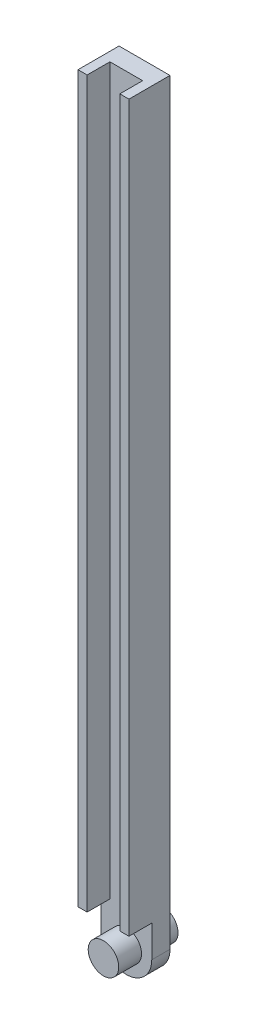
ISO-10303-21;
HEADER;
FILE_DESCRIPTION(('STEP AP214'),'2;1');
FILE_NAME('part.step','',(''),(''),'','','');
FILE_SCHEMA(('AUTOMOTIVE_DESIGN { 1 0 10303 214 1 1 1 1 }'));
ENDSEC;
DATA;
#1=APPLICATION_CONTEXT('core data for automotive mechanical design processes');
#2=APPLICATION_PROTOCOL_DEFINITION('international standard','automotive_design',2000,#1);
#3=PRODUCT_CONTEXT('',#1,'mechanical');
#4=PRODUCT('Part','Part','',(#3));
#5=PRODUCT_RELATED_PRODUCT_CATEGORY('part','',(#4));
#6=PRODUCT_DEFINITION_FORMATION('','',#4);
#7=PRODUCT_DEFINITION_CONTEXT('part definition',#1,'design');
#8=PRODUCT_DEFINITION('design','',#6,#7);
#9=PRODUCT_DEFINITION_SHAPE('','',#8);
#10=(LENGTH_UNIT() NAMED_UNIT(*) SI_UNIT(.MILLI.,.METRE.));
#11=(NAMED_UNIT(*) PLANE_ANGLE_UNIT() SI_UNIT($,.RADIAN.));
#12=(NAMED_UNIT(*) SI_UNIT($,.STERADIAN.) SOLID_ANGLE_UNIT());
#13=UNCERTAINTY_MEASURE_WITH_UNIT(LENGTH_MEASURE(1.E-05),#10,'distance_accuracy_value','');
#14=(GEOMETRIC_REPRESENTATION_CONTEXT(3) GLOBAL_UNCERTAINTY_ASSIGNED_CONTEXT((#13)) GLOBAL_UNIT_ASSIGNED_CONTEXT((#10,
#11,#12)) REPRESENTATION_CONTEXT('',''));
#15=CARTESIAN_POINT('',(0.,0.,0.));
#16=DIRECTION('',(0.,0.,1.));
#17=DIRECTION('',(1.,0.,0.));
#18=AXIS2_PLACEMENT_3D('',#15,#16,#17);
#19=CARTESIAN_POINT('',(-1300.10015144345,-1591.6006167327,50.8));
#20=DIRECTION('',(-1.,0.,0.));
#21=DIRECTION('',(0.,0.,1.));
#22=AXIS2_PLACEMENT_3D('',#19,#20,#21);
#23=PLANE('',#22);
#24=DIRECTION('',(0.,1.,0.));
#25=VECTOR('',#24,1.);
#26=CARTESIAN_POINT('',(-1300.10015144345,-1591.6006167327,0.));
#27=LINE('',#26,#25);
#28=CARTESIAN_POINT('',(-1300.10015144345,-911.736177466732,0.));
#29=VERTEX_POINT('',#28);
#30=CARTESIAN_POINT('',(-1300.10015144345,1195.64571589692,0.));
#31=VERTEX_POINT('',#30);
#32=EDGE_CURVE('E173',#29,#31,#27,.T.);
#33=ORIENTED_EDGE('',*,*,#32,.F.);
#34=DIRECTION('',(0.,0.,-1.));
#35=VECTOR('',#34,1.);
#36=CARTESIAN_POINT('',(-1300.10015144345,-911.736177466732,50.8));
#37=LINE('',#36,#35);
#38=CARTESIAN_POINT('',(-1300.10015144345,-911.736177466732,50.8));
#39=VERTEX_POINT('',#38);
#40=EDGE_CURVE('E11',#39,#29,#37,.T.);
#41=ORIENTED_EDGE('',*,*,#40,.F.);
#42=DIRECTION('',(0.,1.,0.));
#43=VECTOR('',#42,1.);
#44=CARTESIAN_POINT('',(-1300.10015144345,-1591.6006167327,50.8));
#45=LINE('',#44,#43);
#46=CARTESIAN_POINT('',(-1300.10015144345,-823.181281220059,50.8));
#47=VERTEX_POINT('',#46);
#48=EDGE_CURVE('E177',#39,#47,#45,.T.);
#49=ORIENTED_EDGE('',*,*,#48,.T.);
#50=DIRECTION('',(0.,0.,-1.));
#51=VECTOR('',#50,1.);
#52=CARTESIAN_POINT('',(-1300.10015144345,-823.181281220059,114.3));
#53=LINE('',#52,#51);
#54=CARTESIAN_POINT('',(-1300.10015144345,-823.181281220059,114.3));
#55=VERTEX_POINT('',#54);
#56=EDGE_CURVE('E163',#55,#47,#53,.T.);
#57=ORIENTED_EDGE('',*,*,#56,.F.);
#58=DIRECTION('',(0.,1.,0.));
#59=VECTOR('',#58,1.);
#60=CARTESIAN_POINT('',(-1300.10015144345,-1591.6006167327,114.3));
#61=LINE('',#60,#59);
#62=CARTESIAN_POINT('',(-1300.10015144345,1195.64571589692,114.3));
#63=VERTEX_POINT('',#62);
#64=EDGE_CURVE('E160',#55,#63,#61,.T.);
#65=ORIENTED_EDGE('',*,*,#64,.T.);
#66=DIRECTION('',(0.,0.,-1.));
#67=VECTOR('',#66,1.);
#68=CARTESIAN_POINT('',(-1300.10015144345,1195.64571589692,114.3));
#69=LINE('',#68,#67);
#70=EDGE_CURVE('E165',#63,#31,#69,.T.);
#71=ORIENTED_EDGE('',*,*,#70,.T.);
#72=EDGE_LOOP('',(#33,#41,#49,#57,#65,#71));
#73=FACE_BOUND('',#72,.T.);
#74=ADVANCED_FACE('F33',(#73),#23,.T.);
#75=CARTESIAN_POINT('',(-1229.14777142315,-911.736177466732,50.8));
#76=DIRECTION('',(0.,0.,-1.));
#77=DIRECTION('',(-1.,0.,0.));
#78=AXIS2_PLACEMENT_3D('',#75,#76,#77);
#79=CYLINDRICAL_SURFACE('',#78,70.9523800203058);
#80=CARTESIAN_POINT('',(-1229.14777142315,-911.736177466732,0.));
#81=DIRECTION('',(0.,0.,1.));
#82=DIRECTION('',(1.,0.,0.));
#83=AXIS2_PLACEMENT_3D('',#80,#81,#82);
#84=CIRCLE('',#83,70.9523800203058);
#85=CARTESIAN_POINT('',(-1158.19539140284,-911.736177466732,0.));
#86=VERTEX_POINT('',#85);
#87=EDGE_CURVE('E194',#29,#86,#84,.T.);
#88=ORIENTED_EDGE('',*,*,#87,.T.);
#89=DIRECTION('',(0.,0.,-1.));
#90=VECTOR('',#89,1.);
#91=CARTESIAN_POINT('',(-1158.19539140284,-911.736177466732,50.8));
#92=LINE('',#91,#90);
#93=CARTESIAN_POINT('',(-1158.19539140284,-911.736177466732,50.8));
#94=VERTEX_POINT('',#93);
#95=EDGE_CURVE('E41',#94,#86,#92,.T.);
#96=ORIENTED_EDGE('',*,*,#95,.F.);
#97=CARTESIAN_POINT('',(-1229.14777142315,-911.736177466732,50.8));
#98=DIRECTION('',(0.,0.,1.));
#99=DIRECTION('',(1.,0.,0.));
#100=AXIS2_PLACEMENT_3D('',#97,#98,#99);
#101=CIRCLE('',#100,70.9523800203058);
#102=EDGE_CURVE('E181',#39,#94,#101,.T.);
#103=ORIENTED_EDGE('',*,*,#102,.F.);
#104=ORIENTED_EDGE('',*,*,#40,.T.);
#105=EDGE_LOOP('',(#88,#96,#103,#104));
#106=FACE_BOUND('',#105,.T.);
#107=ADVANCED_FACE('F202',(#106),#79,.T.);
#108=CARTESIAN_POINT('',(-1158.19539140284,-1591.6006167327,50.8));
#109=DIRECTION('',(-1.,0.,0.));
#110=DIRECTION('',(0.,0.,1.));
#111=AXIS2_PLACEMENT_3D('',#108,#109,#110);
#112=PLANE('',#111);
#113=DIRECTION('',(0.,1.,0.));
#114=VECTOR('',#113,1.);
#115=CARTESIAN_POINT('',(-1158.19539140284,-1591.6006167327,0.));
#116=LINE('',#115,#114);
#117=CARTESIAN_POINT('',(-1158.19539140284,1195.64571589692,0.));
#118=VERTEX_POINT('',#117);
#119=EDGE_CURVE('E196',#86,#118,#116,.T.);
#120=ORIENTED_EDGE('',*,*,#119,.T.);
#121=DIRECTION('',(0.,0.,-1.));
#122=VECTOR('',#121,1.);
#123=CARTESIAN_POINT('',(-1158.19539140284,1195.64571589692,114.3));
#124=LINE('',#123,#122);
#125=CARTESIAN_POINT('',(-1158.19539140284,1195.64571589692,114.3));
#126=VERTEX_POINT('',#125);
#127=EDGE_CURVE('E149',#126,#118,#124,.T.);
#128=ORIENTED_EDGE('',*,*,#127,.F.);
#129=DIRECTION('',(0.,1.,0.));
#130=VECTOR('',#129,1.);
#131=CARTESIAN_POINT('',(-1158.19539140284,-1591.6006167327,114.3));
#132=LINE('',#131,#130);
#133=CARTESIAN_POINT('',(-1158.19539140284,-823.181281220059,114.3));
#134=VERTEX_POINT('',#133);
#135=EDGE_CURVE('E133',#134,#126,#132,.T.);
#136=ORIENTED_EDGE('',*,*,#135,.F.);
#137=DIRECTION('',(0.,0.,-1.));
#138=VECTOR('',#137,1.);
#139=CARTESIAN_POINT('',(-1158.19539140284,-823.181281220059,114.3));
#140=LINE('',#139,#138);
#141=CARTESIAN_POINT('',(-1158.19539140284,-823.181281220059,50.8));
#142=VERTEX_POINT('',#141);
#143=EDGE_CURVE('E126',#134,#142,#140,.T.);
#144=ORIENTED_EDGE('',*,*,#143,.T.);
#145=DIRECTION('',(0.,1.,0.));
#146=VECTOR('',#145,1.);
#147=CARTESIAN_POINT('',(-1158.19539140284,-1591.6006167327,50.8));
#148=LINE('',#147,#146);
#149=EDGE_CURVE('E49',#94,#142,#148,.T.);
#150=ORIENTED_EDGE('',*,*,#149,.F.);
#151=ORIENTED_EDGE('',*,*,#95,.T.);
#152=EDGE_LOOP('',(#120,#128,#136,#144,#150,#151));
#153=FACE_BOUND('',#152,.T.);
#154=ADVANCED_FACE('F200',(#153),#112,.F.);
#155=CARTESIAN_POINT('',(-1229.14777142315,1195.64571589692,50.8));
#156=DIRECTION('',(0.,1.,0.));
#157=DIRECTION('',(0.,0.,1.));
#158=AXIS2_PLACEMENT_3D('',#155,#156,#157);
#159=PLANE('',#158);
#160=DIRECTION('',(1.,0.,0.));
#161=VECTOR('',#160,1.);
#162=CARTESIAN_POINT('',(-1229.14777142315,1195.64571589692,0.));
#163=LINE('',#162,#161);
#164=EDGE_CURVE('E178',#31,#118,#163,.T.);
#165=ORIENTED_EDGE('',*,*,#164,.F.);
#166=ORIENTED_EDGE('',*,*,#70,.F.);
#167=DIRECTION('',(1.,0.,0.));
#168=VECTOR('',#167,1.);
#169=CARTESIAN_POINT('',(-1229.14777142315,1195.64571589692,114.3));
#170=LINE('',#169,#168);
#171=CARTESIAN_POINT('',(-1274.70015144345,1195.64571589692,114.3));
#172=VERTEX_POINT('',#171);
#173=EDGE_CURVE('E157',#63,#172,#170,.T.);
#174=ORIENTED_EDGE('',*,*,#173,.T.);
#175=DIRECTION('',(0.,0.,-1.));
#176=VECTOR('',#175,1.);
#177=CARTESIAN_POINT('',(-1274.70015144345,1195.64571589692,114.3));
#178=LINE('',#177,#176);
#179=CARTESIAN_POINT('',(-1274.70015144345,1195.64571589692,50.8));
#180=VERTEX_POINT('',#179);
#181=EDGE_CURVE('E168',#172,#180,#178,.T.);
#182=ORIENTED_EDGE('',*,*,#181,.T.);
#183=DIRECTION('',(1.,0.,0.));
#184=VECTOR('',#183,1.);
#185=CARTESIAN_POINT('',(-1229.14777142315,1195.64571589692,50.8));
#186=LINE('',#185,#184);
#187=CARTESIAN_POINT('',(-1183.59539140284,1195.64571589692,50.8));
#188=VERTEX_POINT('',#187);
#189=EDGE_CURVE('E187',#180,#188,#186,.T.);
#190=ORIENTED_EDGE('',*,*,#189,.T.);
#191=DIRECTION('',(0.,0.,-1.));
#192=VECTOR('',#191,1.);
#193=CARTESIAN_POINT('',(-1183.59539140284,1195.64571589692,114.3));
#194=LINE('',#193,#192);
#195=CARTESIAN_POINT('',(-1183.59539140284,1195.64571589692,114.3));
#196=VERTEX_POINT('',#195);
#197=EDGE_CURVE('E147',#196,#188,#194,.T.);
#198=ORIENTED_EDGE('',*,*,#197,.F.);
#199=DIRECTION('',(1.,0.,0.));
#200=VECTOR('',#199,1.);
#201=CARTESIAN_POINT('',(-1229.14777142315,1195.64571589692,114.3));
#202=LINE('',#201,#200);
#203=EDGE_CURVE('E137',#196,#126,#202,.T.);
#204=ORIENTED_EDGE('',*,*,#203,.T.);
#205=ORIENTED_EDGE('',*,*,#127,.T.);
#206=EDGE_LOOP('',(#165,#166,#174,#182,#190,#198,#204,#205));
#207=FACE_BOUND('',#206,.T.);
#208=ADVANCED_FACE('F212',(#207),#159,.T.);
#209=CARTESIAN_POINT('',(-1229.14777142315,-1591.6006167327,50.8));
#210=DIRECTION('',(0.,0.,1.));
#211=DIRECTION('',(1.,0.,0.));
#212=AXIS2_PLACEMENT_3D('',#209,#210,#211);
#213=PLANE('',#212);
#214=CARTESIAN_POINT('',(-1229.14777142315,-911.736177466732,50.8));
#215=DIRECTION('',(0.,0.,1.));
#216=DIRECTION('',(1.,0.,0.));
#217=AXIS2_PLACEMENT_3D('',#214,#215,#216);
#218=CIRCLE('',#217,42.5147938547676);
#219=CARTESIAN_POINT('',(-1186.63297756838,-911.736177466732,50.8));
#220=VERTEX_POINT('',#219);
#221=EDGE_CURVE('E174',#220,#220,#218,.T.);
#222=ORIENTED_EDGE('',*,*,#221,.F.);
#223=EDGE_LOOP('',(#222));
#224=FACE_BOUND('',#223,.T.);
#225=ORIENTED_EDGE('',*,*,#48,.F.);
#226=ORIENTED_EDGE('',*,*,#102,.T.);
#227=ORIENTED_EDGE('',*,*,#149,.T.);
#228=DIRECTION('',(1.,0.,0.));
#229=VECTOR('',#228,1.);
#230=CARTESIAN_POINT('',(-1229.14777142315,-823.181281220059,50.8));
#231=LINE('',#230,#229);
#232=CARTESIAN_POINT('',(-1183.59539140284,-823.181281220059,50.8));
#233=VERTEX_POINT('',#232);
#234=EDGE_CURVE('E184',#233,#142,#231,.T.);
#235=ORIENTED_EDGE('',*,*,#234,.F.);
#236=DIRECTION('',(0.,1.,0.));
#237=VECTOR('',#236,1.);
#238=CARTESIAN_POINT('',(-1183.59539140284,-1591.6006167327,50.8));
#239=LINE('',#238,#237);
#240=EDGE_CURVE('E122',#233,#188,#239,.T.);
#241=ORIENTED_EDGE('',*,*,#240,.T.);
#242=ORIENTED_EDGE('',*,*,#189,.F.);
#243=DIRECTION('',(0.,1.,0.));
#244=VECTOR('',#243,1.);
#245=CARTESIAN_POINT('',(-1274.70015144345,-1591.6006167327,50.8));
#246=LINE('',#245,#244);
#247=CARTESIAN_POINT('',(-1274.70015144345,-823.181281220059,50.8));
#248=VERTEX_POINT('',#247);
#249=EDGE_CURVE('E190',#248,#180,#246,.T.);
#250=ORIENTED_EDGE('',*,*,#249,.F.);
#251=DIRECTION('',(1.,0.,0.));
#252=VECTOR('',#251,1.);
#253=CARTESIAN_POINT('',(-1229.14777142315,-823.181281220059,50.8));
#254=LINE('',#253,#252);
#255=EDGE_CURVE('E67',#47,#248,#254,.T.);
#256=ORIENTED_EDGE('',*,*,#255,.F.);
#257=EDGE_LOOP('',(#225,#226,#227,#235,#241,#242,#250,#256));
#258=FACE_BOUND('',#257,.T.);
#259=ADVANCED_FACE('F223',(#224,#258),#213,.T.);
#260=CARTESIAN_POINT('',(-1229.14777142315,-1591.6006167327,0.));
#261=DIRECTION('',(0.,0.,1.));
#262=DIRECTION('',(1.,0.,0.));
#263=AXIS2_PLACEMENT_3D('',#260,#261,#262);
#264=PLANE('',#263);
#265=ORIENTED_EDGE('',*,*,#164,.T.);
#266=ORIENTED_EDGE('',*,*,#119,.F.);
#267=ORIENTED_EDGE('',*,*,#87,.F.);
#268=ORIENTED_EDGE('',*,*,#32,.T.);
#269=EDGE_LOOP('',(#265,#266,#267,#268));
#270=FACE_BOUND('',#269,.T.);
#271=CARTESIAN_POINT('',(-1229.14777142315,-911.736177466732,0.));
#272=DIRECTION('',(0.,0.,1.));
#273=DIRECTION('',(1.,0.,0.));
#274=AXIS2_PLACEMENT_3D('',#271,#272,#273);
#275=CIRCLE('',#274,42.5147938547676);
#276=CARTESIAN_POINT('',(-1186.63297756838,-911.736177466732,0.));
#277=VERTEX_POINT('',#276);
#278=EDGE_CURVE('E138',#277,#277,#275,.T.);
#279=ORIENTED_EDGE('',*,*,#278,.T.);
#280=EDGE_LOOP('',(#279));
#281=FACE_BOUND('',#280,.T.);
#282=ADVANCED_FACE('F205',(#270,#281),#264,.F.);
#283=CARTESIAN_POINT('',(-1229.14777142315,-823.181281220059,114.3));
#284=DIRECTION('',(0.,1.,0.));
#285=DIRECTION('',(0.,0.,1.));
#286=AXIS2_PLACEMENT_3D('',#283,#284,#285);
#287=PLANE('',#286);
#288=ORIENTED_EDGE('',*,*,#255,.T.);
#289=DIRECTION('',(0.,0.,-1.));
#290=VECTOR('',#289,1.);
#291=CARTESIAN_POINT('',(-1274.70015144345,-823.181281220059,114.3));
#292=LINE('',#291,#290);
#293=CARTESIAN_POINT('',(-1274.70015144345,-823.181281220059,114.3));
#294=VERTEX_POINT('',#293);
#295=EDGE_CURVE('E171',#294,#248,#292,.T.);
#296=ORIENTED_EDGE('',*,*,#295,.F.);
#297=DIRECTION('',(1.,0.,0.));
#298=VECTOR('',#297,1.);
#299=CARTESIAN_POINT('',(-1229.14777142315,-823.181281220059,114.3));
#300=LINE('',#299,#298);
#301=EDGE_CURVE('E125',#55,#294,#300,.T.);
#302=ORIENTED_EDGE('',*,*,#301,.F.);
#303=ORIENTED_EDGE('',*,*,#56,.T.);
#304=EDGE_LOOP('',(#288,#296,#302,#303));
#305=FACE_BOUND('',#304,.T.);
#306=ADVANCED_FACE('F224',(#305),#287,.F.);
#307=CARTESIAN_POINT('',(-1274.70015144345,-1591.6006167327,114.3));
#308=DIRECTION('',(-1.,0.,0.));
#309=DIRECTION('',(0.,0.,1.));
#310=AXIS2_PLACEMENT_3D('',#307,#308,#309);
#311=PLANE('',#310);
#312=ORIENTED_EDGE('',*,*,#249,.T.);
#313=ORIENTED_EDGE('',*,*,#181,.F.);
#314=DIRECTION('',(0.,1.,0.));
#315=VECTOR('',#314,1.);
#316=CARTESIAN_POINT('',(-1274.70015144345,-1591.6006167327,114.3));
#317=LINE('',#316,#315);
#318=EDGE_CURVE('E155',#294,#172,#317,.T.);
#319=ORIENTED_EDGE('',*,*,#318,.F.);
#320=ORIENTED_EDGE('',*,*,#295,.T.);
#321=EDGE_LOOP('',(#312,#313,#319,#320));
#322=FACE_BOUND('',#321,.T.);
#323=ADVANCED_FACE('F218',(#322),#311,.F.);
#324=CARTESIAN_POINT('',(-1229.14777142315,-1591.6006167327,114.3));
#325=DIRECTION('',(0.,0.,1.));
#326=DIRECTION('',(1.,0.,0.));
#327=AXIS2_PLACEMENT_3D('',#324,#325,#326);
#328=PLANE('',#327);
#329=ORIENTED_EDGE('',*,*,#301,.T.);
#330=ORIENTED_EDGE('',*,*,#318,.T.);
#331=ORIENTED_EDGE('',*,*,#173,.F.);
#332=ORIENTED_EDGE('',*,*,#64,.F.);
#333=EDGE_LOOP('',(#329,#330,#331,#332));
#334=FACE_BOUND('',#333,.T.);
#335=ADVANCED_FACE('F214',(#334),#328,.T.);
#336=CARTESIAN_POINT('',(-1183.59539140284,-1591.6006167327,114.3));
#337=DIRECTION('',(-1.,0.,0.));
#338=DIRECTION('',(0.,0.,1.));
#339=AXIS2_PLACEMENT_3D('',#336,#337,#338);
#340=PLANE('',#339);
#341=ORIENTED_EDGE('',*,*,#197,.T.);
#342=ORIENTED_EDGE('',*,*,#240,.F.);
#343=DIRECTION('',(0.,0.,-1.));
#344=VECTOR('',#343,1.);
#345=CARTESIAN_POINT('',(-1183.59539140284,-823.181281220059,114.3));
#346=LINE('',#345,#344);
#347=CARTESIAN_POINT('',(-1183.59539140284,-823.181281220059,114.3));
#348=VERTEX_POINT('',#347);
#349=EDGE_CURVE('E115',#348,#233,#346,.T.);
#350=ORIENTED_EDGE('',*,*,#349,.F.);
#351=DIRECTION('',(0.,1.,0.));
#352=VECTOR('',#351,1.);
#353=CARTESIAN_POINT('',(-1183.59539140284,-1591.6006167327,114.3));
#354=LINE('',#353,#352);
#355=EDGE_CURVE('E119',#348,#196,#354,.T.);
#356=ORIENTED_EDGE('',*,*,#355,.T.);
#357=EDGE_LOOP('',(#341,#342,#350,#356));
#358=FACE_BOUND('',#357,.T.);
#359=ADVANCED_FACE('F117',(#358),#340,.T.);
#360=CARTESIAN_POINT('',(-1229.14777142315,-823.181281220059,114.3));
#361=DIRECTION('',(0.,1.,0.));
#362=DIRECTION('',(0.,0.,1.));
#363=AXIS2_PLACEMENT_3D('',#360,#361,#362);
#364=PLANE('',#363);
#365=ORIENTED_EDGE('',*,*,#234,.T.);
#366=ORIENTED_EDGE('',*,*,#143,.F.);
#367=DIRECTION('',(1.,0.,0.));
#368=VECTOR('',#367,1.);
#369=CARTESIAN_POINT('',(-1229.14777142315,-823.181281220059,114.3));
#370=LINE('',#369,#368);
#371=EDGE_CURVE('E129',#348,#134,#370,.T.);
#372=ORIENTED_EDGE('',*,*,#371,.F.);
#373=ORIENTED_EDGE('',*,*,#349,.T.);
#374=EDGE_LOOP('',(#365,#366,#372,#373));
#375=FACE_BOUND('',#374,.T.);
#376=ADVANCED_FACE('F130',(#375),#364,.F.);
#377=CARTESIAN_POINT('',(-1229.14777142315,-1591.6006167327,114.3));
#378=DIRECTION('',(0.,0.,1.));
#379=DIRECTION('',(1.,0.,0.));
#380=AXIS2_PLACEMENT_3D('',#377,#378,#379);
#381=PLANE('',#380);
#382=ORIENTED_EDGE('',*,*,#355,.F.);
#383=ORIENTED_EDGE('',*,*,#371,.T.);
#384=ORIENTED_EDGE('',*,*,#135,.T.);
#385=ORIENTED_EDGE('',*,*,#203,.F.);
#386=EDGE_LOOP('',(#382,#383,#384,#385));
#387=FACE_BOUND('',#386,.T.);
#388=ADVANCED_FACE('F135',(#387),#381,.T.);
#389=CARTESIAN_POINT('',(-1229.14777142315,-911.736177466732,-50.8));
#390=DIRECTION('',(0.,0.,-1.));
#391=DIRECTION('',(-1.,0.,0.));
#392=AXIS2_PLACEMENT_3D('',#389,#390,#391);
#393=PLANE('',#392);
#394=CARTESIAN_POINT('',(-1229.14777142315,-911.736177466732,-50.8));
#395=DIRECTION('',(0.,0.,-1.));
#396=DIRECTION('',(-1.,0.,0.));
#397=AXIS2_PLACEMENT_3D('',#394,#395,#396);
#398=CIRCLE('',#397,42.5147938547676);
#399=CARTESIAN_POINT('',(-1271.66256527791,-911.736177466732,-50.8));
#400=VERTEX_POINT('',#399);
#401=EDGE_CURVE('E259',#400,#400,#398,.T.);
#402=ORIENTED_EDGE('',*,*,#401,.T.);
#403=EDGE_LOOP('',(#402));
#404=FACE_BOUND('',#403,.T.);
#405=ADVANCED_FACE('F264',(#404),#393,.T.);
#406=CARTESIAN_POINT('',(-1229.14777142315,-911.736177466732,234.549996141817));
#407=DIRECTION('',(0.,0.,-1.));
#408=DIRECTION('',(-1.,0.,0.));
#409=AXIS2_PLACEMENT_3D('',#406,#407,#408);
#410=CYLINDRICAL_SURFACE('',#409,42.5147938547676);
#411=ORIENTED_EDGE('',*,*,#401,.F.);
#412=EDGE_LOOP('',(#411));
#413=FACE_BOUND('',#412,.T.);
#414=ORIENTED_EDGE('',*,*,#278,.F.);
#415=EDGE_LOOP('',(#414));
#416=FACE_BOUND('',#415,.T.);
#417=ADVANCED_FACE('F255',(#413,#416),#410,.T.);
#418=CARTESIAN_POINT('',(-1229.14777142315,-1591.6006167327,114.3));
#419=DIRECTION('',(0.,0.,1.));
#420=DIRECTION('',(1.,0.,0.));
#421=AXIS2_PLACEMENT_3D('',#418,#419,#420);
#422=PLANE('',#421);
#423=CARTESIAN_POINT('',(-1229.14777142315,-911.736177466732,114.3));
#424=DIRECTION('',(0.,0.,1.));
#425=DIRECTION('',(1.,0.,0.));
#426=AXIS2_PLACEMENT_3D('',#423,#424,#425);
#427=CIRCLE('',#426,42.5147938547676);
#428=CARTESIAN_POINT('',(-1186.63297756838,-911.736177466732,114.3));
#429=VERTEX_POINT('',#428);
#430=EDGE_CURVE('E141',#429,#429,#427,.F.);
#431=ORIENTED_EDGE('',*,*,#430,.F.);
#432=EDGE_LOOP('',(#431));
#433=FACE_BOUND('',#432,.T.);
#434=ADVANCED_FACE('F253',(#433),#422,.T.);
#435=ORIENTED_EDGE('',*,*,#221,.T.);
#436=EDGE_LOOP('',(#435));
#437=FACE_BOUND('',#436,.T.);
#438=ORIENTED_EDGE('',*,*,#430,.T.);
#439=EDGE_LOOP('',(#438));
#440=FACE_BOUND('',#439,.T.);
#441=ADVANCED_FACE('F250',(#437,#440),#410,.T.);
#442=CLOSED_SHELL('',(#74,#107,#154,#208,#259,#282,#306,#323,#335,#359,#376,#388,#405,#417,#434,#441));
#443=MANIFOLD_SOLID_BREP('B2',#442);
#444=ADVANCED_BREP_SHAPE_REPRESENTATION('',(#18,#443),#14);
#445=SHAPE_DEFINITION_REPRESENTATION(#9,#444);
ENDSEC;
END-ISO-10303-21;
